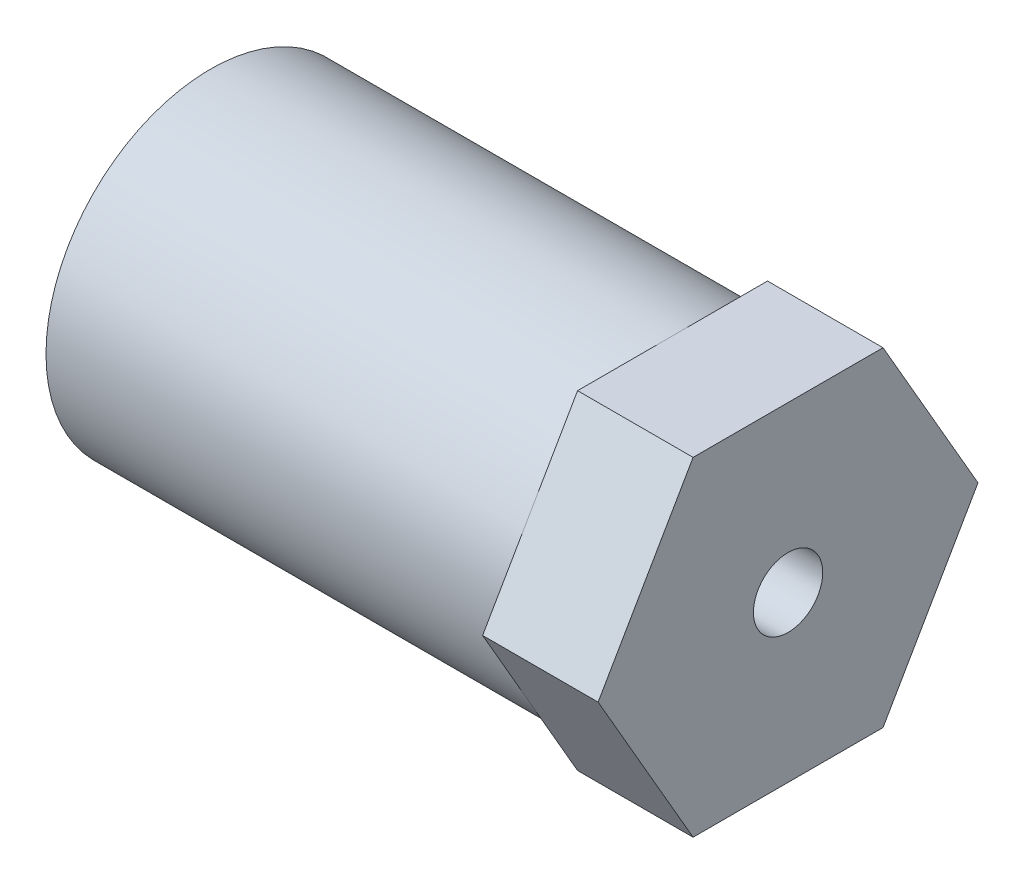
ISO-10303-21;
HEADER;
FILE_DESCRIPTION(('STEP AP214'),'2;1');
FILE_NAME('part.step','',(''),(''),'','','');
FILE_SCHEMA(('AUTOMOTIVE_DESIGN { 1 0 10303 214 1 1 1 1 }'));
ENDSEC;
DATA;
#1=APPLICATION_CONTEXT('core data for automotive mechanical design processes');
#2=APPLICATION_PROTOCOL_DEFINITION('international standard','automotive_design',2000,#1);
#3=PRODUCT_CONTEXT('',#1,'mechanical');
#4=PRODUCT('Part','Part','',(#3));
#5=PRODUCT_RELATED_PRODUCT_CATEGORY('part','',(#4));
#6=PRODUCT_DEFINITION_FORMATION('','',#4);
#7=PRODUCT_DEFINITION_CONTEXT('part definition',#1,'design');
#8=PRODUCT_DEFINITION('design','',#6,#7);
#9=PRODUCT_DEFINITION_SHAPE('','',#8);
#10=(LENGTH_UNIT() NAMED_UNIT(*) SI_UNIT(.MILLI.,.METRE.));
#11=(NAMED_UNIT(*) PLANE_ANGLE_UNIT() SI_UNIT($,.RADIAN.));
#12=(NAMED_UNIT(*) SI_UNIT($,.STERADIAN.) SOLID_ANGLE_UNIT());
#13=UNCERTAINTY_MEASURE_WITH_UNIT(LENGTH_MEASURE(1.E-05),#10,'distance_accuracy_value','');
#14=(GEOMETRIC_REPRESENTATION_CONTEXT(3) GLOBAL_UNCERTAINTY_ASSIGNED_CONTEXT((#13)) GLOBAL_UNIT_ASSIGNED_CONTEXT((#10,
#11,#12)) REPRESENTATION_CONTEXT('',''));
#15=CARTESIAN_POINT('',(0.,0.,0.));
#16=DIRECTION('',(0.,0.,1.));
#17=DIRECTION('',(1.,0.,0.));
#18=AXIS2_PLACEMENT_3D('',#15,#16,#17);
#19=CARTESIAN_POINT('',(0.,7.12,0.));
#20=DIRECTION('',(1.,0.,0.));
#21=DIRECTION('',(0.,0.,-1.));
#22=AXIS2_PLACEMENT_3D('',#19,#20,#21);
#23=PLANE('',#22);
#24=CARTESIAN_POINT('',(0.,0.,0.));
#25=DIRECTION('',(-1.,0.,0.));
#26=DIRECTION('',(0.,0.,1.));
#27=AXIS2_PLACEMENT_3D('',#24,#25,#26);
#28=CIRCLE('',#27,3.);
#29=CARTESIAN_POINT('',(0.,0.,3.));
#30=VERTEX_POINT('',#29);
#31=EDGE_CURVE('E145',#30,#30,#28,.T.);
#32=ORIENTED_EDGE('',*,*,#31,.F.);
#33=EDGE_LOOP('',(#32));
#34=FACE_BOUND('',#33,.T.);
#35=CARTESIAN_POINT('',(0.,0.,0.));
#36=DIRECTION('',(-1.,0.,0.));
#37=DIRECTION('',(0.,0.,1.));
#38=AXIS2_PLACEMENT_3D('',#35,#36,#37);
#39=CIRCLE('',#38,7.12);
#40=CARTESIAN_POINT('',(0.,0.,7.12));
#41=VERTEX_POINT('',#40);
#42=EDGE_CURVE('E156',#41,#41,#39,.T.);
#43=ORIENTED_EDGE('',*,*,#42,.T.);
#44=EDGE_LOOP('',(#43));
#45=FACE_BOUND('',#44,.T.);
#46=ADVANCED_FACE('F45',(#34,#45),#23,.F.);
#47=CARTESIAN_POINT('',(-15.9769543124888,0.,0.));
#48=DIRECTION('',(-1.,0.,0.));
#49=DIRECTION('',(0.,0.,1.));
#50=AXIS2_PLACEMENT_3D('',#47,#48,#49);
#51=CYLINDRICAL_SURFACE('',#50,7.12);
#52=ORIENTED_EDGE('',*,*,#42,.F.);
#53=EDGE_LOOP('',(#52));
#54=FACE_BOUND('',#53,.T.);
#55=CARTESIAN_POINT('',(20.,0.,0.));
#56=DIRECTION('',(-1.,0.,0.));
#57=DIRECTION('',(0.,0.,1.));
#58=AXIS2_PLACEMENT_3D('',#55,#56,#57);
#59=CIRCLE('',#58,7.12);
#60=CARTESIAN_POINT('',(20.,3.56,6.16610087494521));
#61=VERTEX_POINT('',#60);
#62=CARTESIAN_POINT('',(20.,7.12,0.));
#63=VERTEX_POINT('',#62);
#64=EDGE_CURVE('E11',#61,#63,#59,.T.);
#65=ORIENTED_EDGE('',*,*,#64,.T.);
#66=CARTESIAN_POINT('',(20.,3.56,-6.1661008749452));
#67=VERTEX_POINT('',#66);
#68=EDGE_CURVE('E53',#63,#67,#59,.T.);
#69=ORIENTED_EDGE('',*,*,#68,.T.);
#70=CARTESIAN_POINT('',(20.,-3.56,-6.1661008749452));
#71=VERTEX_POINT('',#70);
#72=EDGE_CURVE('E69',#67,#71,#59,.T.);
#73=ORIENTED_EDGE('',*,*,#72,.T.);
#74=CARTESIAN_POINT('',(20.,-7.12,0.));
#75=VERTEX_POINT('',#74);
#76=EDGE_CURVE('E164',#71,#75,#59,.T.);
#77=ORIENTED_EDGE('',*,*,#76,.T.);
#78=CARTESIAN_POINT('',(20.,-3.56,6.16610087494521));
#79=VERTEX_POINT('',#78);
#80=EDGE_CURVE('E161',#75,#79,#59,.T.);
#81=ORIENTED_EDGE('',*,*,#80,.T.);
#82=EDGE_CURVE('E54',#79,#61,#59,.T.);
#83=ORIENTED_EDGE('',*,*,#82,.T.);
#84=EDGE_LOOP('',(#65,#69,#73,#77,#81,#83));
#85=FACE_BOUND('',#84,.T.);
#86=ADVANCED_FACE('F167',(#54,#85),#51,.T.);
#87=CARTESIAN_POINT('',(12.,0.,0.));
#88=DIRECTION('',(1.,0.,0.));
#89=DIRECTION('',(0.,0.,-1.));
#90=AXIS2_PLACEMENT_3D('',#87,#88,#89);
#91=PLANE('',#90);
#92=CARTESIAN_POINT('',(12.,0.,0.));
#93=DIRECTION('',(1.,0.,0.));
#94=DIRECTION('',(0.,0.,-1.));
#95=AXIS2_PLACEMENT_3D('',#92,#93,#94);
#96=CIRCLE('',#95,1.5);
#97=CARTESIAN_POINT('',(12.,0.,-1.5));
#98=VERTEX_POINT('',#97);
#99=EDGE_CURVE('E214',#98,#98,#96,.T.);
#100=ORIENTED_EDGE('',*,*,#99,.T.);
#101=EDGE_LOOP('',(#100));
#102=FACE_BOUND('',#101,.T.);
#103=CARTESIAN_POINT('',(12.,0.,0.));
#104=DIRECTION('',(-1.,0.,0.));
#105=DIRECTION('',(0.,0.,1.));
#106=AXIS2_PLACEMENT_3D('',#103,#104,#105);
#107=CIRCLE('',#106,3.);
#108=CARTESIAN_POINT('',(12.,0.,3.));
#109=VERTEX_POINT('',#108);
#110=EDGE_CURVE('E148',#109,#109,#107,.T.);
#111=ORIENTED_EDGE('',*,*,#110,.T.);
#112=EDGE_LOOP('',(#111));
#113=FACE_BOUND('',#112,.T.);
#114=ADVANCED_FACE('F248',(#102,#113),#91,.F.);
#115=CARTESIAN_POINT('',(-15.9769543124888,0.,0.));
#116=DIRECTION('',(-1.,0.,0.));
#117=DIRECTION('',(0.,0.,1.));
#118=AXIS2_PLACEMENT_3D('',#115,#116,#117);
#119=CYLINDRICAL_SURFACE('',#118,3.);
#120=ORIENTED_EDGE('',*,*,#110,.F.);
#121=EDGE_LOOP('',(#120));
#122=FACE_BOUND('',#121,.T.);
#123=ORIENTED_EDGE('',*,*,#31,.T.);
#124=EDGE_LOOP('',(#123));
#125=FACE_BOUND('',#124,.T.);
#126=ADVANCED_FACE('F252',(#122,#125),#119,.F.);
#127=CARTESIAN_POINT('',(20.,0.,0.));
#128=DIRECTION('',(1.,0.,0.));
#129=DIRECTION('',(0.,0.,-1.));
#130=AXIS2_PLACEMENT_3D('',#127,#128,#129);
#131=PLANE('',#130);
#132=ORIENTED_EDGE('',*,*,#64,.F.);
#133=DIRECTION('',(0.,-0.866025403784439,0.5));
#134=VECTOR('',#133,1.);
#135=CARTESIAN_POINT('',(20.,7.12,4.11073391663014));
#136=LINE('',#135,#134);
#137=CARTESIAN_POINT('',(20.,7.12,4.11073391663014));
#138=VERTEX_POINT('',#137);
#139=EDGE_CURVE('E61',#138,#61,#136,.T.);
#140=ORIENTED_EDGE('',*,*,#139,.F.);
#141=DIRECTION('',(0.,0.,1.));
#142=VECTOR('',#141,1.);
#143=CARTESIAN_POINT('',(20.,7.12,-4.11073391663013));
#144=LINE('',#143,#142);
#145=EDGE_CURVE('E177',#63,#138,#144,.T.);
#146=ORIENTED_EDGE('',*,*,#145,.F.);
#147=EDGE_LOOP('',(#132,#140,#146));
#148=FACE_BOUND('',#147,.T.);
#149=ADVANCED_FACE('F178',(#148),#131,.F.);
#150=ORIENTED_EDGE('',*,*,#68,.F.);
#151=CARTESIAN_POINT('',(20.,7.12,-4.11073391663013));
#152=VERTEX_POINT('',#151);
#153=EDGE_CURVE('E174',#152,#63,#144,.T.);
#154=ORIENTED_EDGE('',*,*,#153,.F.);
#155=DIRECTION('',(0.,0.866025403784439,0.5));
#156=VECTOR('',#155,1.);
#157=CARTESIAN_POINT('',(20.,0.,-8.22146783326027));
#158=LINE('',#157,#156);
#159=EDGE_CURVE('E175',#67,#152,#158,.T.);
#160=ORIENTED_EDGE('',*,*,#159,.F.);
#161=EDGE_LOOP('',(#150,#154,#160));
#162=FACE_BOUND('',#161,.T.);
#163=ADVANCED_FACE('F172',(#162),#131,.F.);
#164=ORIENTED_EDGE('',*,*,#72,.F.);
#165=CARTESIAN_POINT('',(20.,0.,-8.22146783326027));
#166=VERTEX_POINT('',#165);
#167=EDGE_CURVE('E181',#166,#67,#158,.T.);
#168=ORIENTED_EDGE('',*,*,#167,.F.);
#169=DIRECTION('',(0.,0.866025403784439,-0.5));
#170=VECTOR('',#169,1.);
#171=CARTESIAN_POINT('',(20.,-7.12,-4.11073391663013));
#172=LINE('',#171,#170);
#173=EDGE_CURVE('E144',#71,#166,#172,.T.);
#174=ORIENTED_EDGE('',*,*,#173,.F.);
#175=EDGE_LOOP('',(#164,#168,#174));
#176=FACE_BOUND('',#175,.T.);
#177=ADVANCED_FACE('F282',(#176),#131,.F.);
#178=ORIENTED_EDGE('',*,*,#76,.F.);
#179=CARTESIAN_POINT('',(20.,-7.12,-4.11073391663013));
#180=VERTEX_POINT('',#179);
#181=EDGE_CURVE('E212',#180,#71,#172,.T.);
#182=ORIENTED_EDGE('',*,*,#181,.F.);
#183=DIRECTION('',(0.,0.,-1.));
#184=VECTOR('',#183,1.);
#185=CARTESIAN_POINT('',(20.,-7.12,4.11073391663014));
#186=LINE('',#185,#184);
#187=EDGE_CURVE('E193',#75,#180,#186,.T.);
#188=ORIENTED_EDGE('',*,*,#187,.F.);
#189=EDGE_LOOP('',(#178,#182,#188));
#190=FACE_BOUND('',#189,.T.);
#191=ADVANCED_FACE('F281',(#190),#131,.F.);
#192=ORIENTED_EDGE('',*,*,#80,.F.);
#193=CARTESIAN_POINT('',(20.,-7.12,4.11073391663014));
#194=VERTEX_POINT('',#193);
#195=EDGE_CURVE('E140',#194,#75,#186,.T.);
#196=ORIENTED_EDGE('',*,*,#195,.F.);
#197=DIRECTION('',(0.,-0.866025403784439,-0.5));
#198=VECTOR('',#197,1.);
#199=CARTESIAN_POINT('',(20.,0.,8.22146783326027));
#200=LINE('',#199,#198);
#201=EDGE_CURVE('E189',#79,#194,#200,.T.);
#202=ORIENTED_EDGE('',*,*,#201,.F.);
#203=EDGE_LOOP('',(#192,#196,#202));
#204=FACE_BOUND('',#203,.T.);
#205=ADVANCED_FACE('F236',(#204),#131,.F.);
#206=CARTESIAN_POINT('',(25.,-7.12,-4.11073391663013));
#207=DIRECTION('',(0.,0.5,0.866025403784439));
#208=DIRECTION('',(0.,-0.866025403784439,0.5));
#209=AXIS2_PLACEMENT_3D('',#206,#207,#208);
#210=PLANE('',#209);
#211=ORIENTED_EDGE('',*,*,#181,.T.);
#212=ORIENTED_EDGE('',*,*,#173,.T.);
#213=DIRECTION('',(-1.,0.,0.));
#214=VECTOR('',#213,1.);
#215=CARTESIAN_POINT('',(25.,0.,-8.22146783326027));
#216=LINE('',#215,#214);
#217=CARTESIAN_POINT('',(25.,0.,-8.22146783326027));
#218=VERTEX_POINT('',#217);
#219=EDGE_CURVE('E125',#218,#166,#216,.T.);
#220=ORIENTED_EDGE('',*,*,#219,.F.);
#221=DIRECTION('',(0.,0.866025403784439,-0.5));
#222=VECTOR('',#221,1.);
#223=CARTESIAN_POINT('',(25.,-7.12,-4.11073391663013));
#224=LINE('',#223,#222);
#225=CARTESIAN_POINT('',(25.,-7.12,-4.11073391663013));
#226=VERTEX_POINT('',#225);
#227=EDGE_CURVE('E131',#226,#218,#224,.T.);
#228=ORIENTED_EDGE('',*,*,#227,.F.);
#229=DIRECTION('',(-1.,0.,0.));
#230=VECTOR('',#229,1.);
#231=CARTESIAN_POINT('',(25.,-7.12,-4.11073391663013));
#232=LINE('',#231,#230);
#233=EDGE_CURVE('E196',#226,#180,#232,.T.);
#234=ORIENTED_EDGE('',*,*,#233,.T.);
#235=EDGE_LOOP('',(#211,#212,#220,#228,#234));
#236=FACE_BOUND('',#235,.T.);
#237=ADVANCED_FACE('F143',(#236),#210,.F.);
#238=CARTESIAN_POINT('',(25.,0.,-8.22146783326027));
#239=DIRECTION('',(0.,-0.5,0.866025403784439));
#240=DIRECTION('',(0.,-0.866025403784439,-0.5));
#241=AXIS2_PLACEMENT_3D('',#238,#239,#240);
#242=PLANE('',#241);
#243=ORIENTED_EDGE('',*,*,#167,.T.);
#244=ORIENTED_EDGE('',*,*,#159,.T.);
#245=DIRECTION('',(-1.,0.,0.));
#246=VECTOR('',#245,1.);
#247=CARTESIAN_POINT('',(25.,7.12,-4.11073391663013));
#248=LINE('',#247,#246);
#249=CARTESIAN_POINT('',(25.,7.12,-4.11073391663013));
#250=VERTEX_POINT('',#249);
#251=EDGE_CURVE('E127',#250,#152,#248,.T.);
#252=ORIENTED_EDGE('',*,*,#251,.F.);
#253=DIRECTION('',(0.,0.866025403784439,0.5));
#254=VECTOR('',#253,1.);
#255=CARTESIAN_POINT('',(25.,0.,-8.22146783326027));
#256=LINE('',#255,#254);
#257=EDGE_CURVE('E120',#218,#250,#256,.T.);
#258=ORIENTED_EDGE('',*,*,#257,.F.);
#259=ORIENTED_EDGE('',*,*,#219,.T.);
#260=EDGE_LOOP('',(#243,#244,#252,#258,#259));
#261=FACE_BOUND('',#260,.T.);
#262=ADVANCED_FACE('F123',(#261),#242,.F.);
#263=CARTESIAN_POINT('',(25.,7.12,-4.11073391663013));
#264=DIRECTION('',(0.,-1.,0.));
#265=DIRECTION('',(0.,0.,-1.));
#266=AXIS2_PLACEMENT_3D('',#263,#264,#265);
#267=PLANE('',#266);
#268=ORIENTED_EDGE('',*,*,#153,.T.);
#269=ORIENTED_EDGE('',*,*,#145,.T.);
#270=DIRECTION('',(-1.,0.,0.));
#271=VECTOR('',#270,1.);
#272=CARTESIAN_POINT('',(25.,7.12,4.11073391663014));
#273=LINE('',#272,#271);
#274=CARTESIAN_POINT('',(25.,7.12,4.11073391663014));
#275=VERTEX_POINT('',#274);
#276=EDGE_CURVE('E150',#275,#138,#273,.T.);
#277=ORIENTED_EDGE('',*,*,#276,.F.);
#278=DIRECTION('',(0.,0.,1.));
#279=VECTOR('',#278,1.);
#280=CARTESIAN_POINT('',(25.,7.12,-4.11073391663013));
#281=LINE('',#280,#279);
#282=EDGE_CURVE('E130',#250,#275,#281,.T.);
#283=ORIENTED_EDGE('',*,*,#282,.F.);
#284=ORIENTED_EDGE('',*,*,#251,.T.);
#285=EDGE_LOOP('',(#268,#269,#277,#283,#284));
#286=FACE_BOUND('',#285,.T.);
#287=ADVANCED_FACE('F183',(#286),#267,.F.);
#288=CARTESIAN_POINT('',(25.,7.12,4.11073391663014));
#289=DIRECTION('',(0.,-0.5,-0.866025403784439));
#290=DIRECTION('',(0.,0.866025403784439,-0.5));
#291=AXIS2_PLACEMENT_3D('',#288,#289,#290);
#292=PLANE('',#291);
#293=ORIENTED_EDGE('',*,*,#139,.T.);
#294=CARTESIAN_POINT('',(20.,0.,8.22146783326027));
#295=VERTEX_POINT('',#294);
#296=EDGE_CURVE('E184',#61,#295,#136,.T.);
#297=ORIENTED_EDGE('',*,*,#296,.T.);
#298=DIRECTION('',(-1.,0.,0.));
#299=VECTOR('',#298,1.);
#300=CARTESIAN_POINT('',(25.,0.,8.22146783326027));
#301=LINE('',#300,#299);
#302=CARTESIAN_POINT('',(25.,0.,8.22146783326027));
#303=VERTEX_POINT('',#302);
#304=EDGE_CURVE('E201',#303,#295,#301,.T.);
#305=ORIENTED_EDGE('',*,*,#304,.F.);
#306=DIRECTION('',(0.,-0.866025403784439,0.5));
#307=VECTOR('',#306,1.);
#308=CARTESIAN_POINT('',(25.,7.12,4.11073391663014));
#309=LINE('',#308,#307);
#310=EDGE_CURVE('E206',#275,#303,#309,.T.);
#311=ORIENTED_EDGE('',*,*,#310,.F.);
#312=ORIENTED_EDGE('',*,*,#276,.T.);
#313=EDGE_LOOP('',(#293,#297,#305,#311,#312));
#314=FACE_BOUND('',#313,.T.);
#315=ADVANCED_FACE('F204',(#314),#292,.F.);
#316=CARTESIAN_POINT('',(25.,0.,8.22146783326027));
#317=DIRECTION('',(0.,0.5,-0.866025403784439));
#318=DIRECTION('',(0.,0.866025403784439,0.5));
#319=AXIS2_PLACEMENT_3D('',#316,#317,#318);
#320=PLANE('',#319);
#321=EDGE_CURVE('E190',#295,#79,#200,.T.);
#322=ORIENTED_EDGE('',*,*,#321,.T.);
#323=ORIENTED_EDGE('',*,*,#201,.T.);
#324=DIRECTION('',(-1.,0.,0.));
#325=VECTOR('',#324,1.);
#326=CARTESIAN_POINT('',(25.,-7.12,4.11073391663014));
#327=LINE('',#326,#325);
#328=CARTESIAN_POINT('',(25.,-7.12,4.11073391663014));
#329=VERTEX_POINT('',#328);
#330=EDGE_CURVE('E198',#329,#194,#327,.T.);
#331=ORIENTED_EDGE('',*,*,#330,.F.);
#332=DIRECTION('',(0.,-0.866025403784439,-0.5));
#333=VECTOR('',#332,1.);
#334=CARTESIAN_POINT('',(25.,0.,8.22146783326027));
#335=LINE('',#334,#333);
#336=EDGE_CURVE('E208',#303,#329,#335,.T.);
#337=ORIENTED_EDGE('',*,*,#336,.F.);
#338=ORIENTED_EDGE('',*,*,#304,.T.);
#339=EDGE_LOOP('',(#322,#323,#331,#337,#338));
#340=FACE_BOUND('',#339,.T.);
#341=ADVANCED_FACE('F238',(#340),#320,.F.);
#342=CARTESIAN_POINT('',(25.,-7.12,4.11073391663014));
#343=DIRECTION('',(0.,1.,0.));
#344=DIRECTION('',(0.,0.,1.));
#345=AXIS2_PLACEMENT_3D('',#342,#343,#344);
#346=PLANE('',#345);
#347=ORIENTED_EDGE('',*,*,#195,.T.);
#348=ORIENTED_EDGE('',*,*,#187,.T.);
#349=ORIENTED_EDGE('',*,*,#233,.F.);
#350=DIRECTION('',(0.,0.,-1.));
#351=VECTOR('',#350,1.);
#352=CARTESIAN_POINT('',(25.,-7.12,4.11073391663014));
#353=LINE('',#352,#351);
#354=EDGE_CURVE('E136',#329,#226,#353,.T.);
#355=ORIENTED_EDGE('',*,*,#354,.F.);
#356=ORIENTED_EDGE('',*,*,#330,.T.);
#357=EDGE_LOOP('',(#347,#348,#349,#355,#356));
#358=FACE_BOUND('',#357,.T.);
#359=ADVANCED_FACE('F227',(#358),#346,.F.);
#360=CARTESIAN_POINT('',(25.,0.,0.));
#361=DIRECTION('',(1.,0.,0.));
#362=DIRECTION('',(0.,0.,-1.));
#363=AXIS2_PLACEMENT_3D('',#360,#361,#362);
#364=PLANE('',#363);
#365=CARTESIAN_POINT('',(25.,0.,0.));
#366=DIRECTION('',(1.,0.,0.));
#367=DIRECTION('',(0.,0.,-1.));
#368=AXIS2_PLACEMENT_3D('',#365,#366,#367);
#369=CIRCLE('',#368,1.5);
#370=CARTESIAN_POINT('',(25.,0.,-1.5));
#371=VERTEX_POINT('',#370);
#372=EDGE_CURVE('E48',#371,#371,#369,.T.);
#373=ORIENTED_EDGE('',*,*,#372,.F.);
#374=EDGE_LOOP('',(#373));
#375=FACE_BOUND('',#374,.T.);
#376=ORIENTED_EDGE('',*,*,#227,.T.);
#377=ORIENTED_EDGE('',*,*,#257,.T.);
#378=ORIENTED_EDGE('',*,*,#282,.T.);
#379=ORIENTED_EDGE('',*,*,#310,.T.);
#380=ORIENTED_EDGE('',*,*,#336,.T.);
#381=ORIENTED_EDGE('',*,*,#354,.T.);
#382=EDGE_LOOP('',(#376,#377,#378,#379,#380,#381));
#383=FACE_BOUND('',#382,.T.);
#384=ADVANCED_FACE('F134',(#375,#383),#364,.T.);
#385=ORIENTED_EDGE('',*,*,#82,.F.);
#386=ORIENTED_EDGE('',*,*,#321,.F.);
#387=ORIENTED_EDGE('',*,*,#296,.F.);
#388=EDGE_LOOP('',(#385,#386,#387));
#389=FACE_BOUND('',#388,.T.);
#390=ADVANCED_FACE('F226',(#389),#131,.F.);
#391=CARTESIAN_POINT('',(0.,0.,0.));
#392=DIRECTION('',(1.,0.,0.));
#393=DIRECTION('',(0.,0.,-1.));
#394=AXIS2_PLACEMENT_3D('',#391,#392,#393);
#395=CYLINDRICAL_SURFACE('',#394,1.5);
#396=ORIENTED_EDGE('',*,*,#372,.T.);
#397=EDGE_LOOP('',(#396));
#398=FACE_BOUND('',#397,.T.);
#399=ORIENTED_EDGE('',*,*,#99,.F.);
#400=EDGE_LOOP('',(#399));
#401=FACE_BOUND('',#400,.T.);
#402=ADVANCED_FACE('F222',(#398,#401),#395,.F.);
#403=CLOSED_SHELL('',(#46,#86,#114,#126,#149,#163,#177,#191,#205,#237,#262,#287,#315,#341,#359,
#384,#390,#402));
#404=MANIFOLD_SOLID_BREP('B2',#403);
#405=ADVANCED_BREP_SHAPE_REPRESENTATION('',(#18,#404),#14);
#406=SHAPE_DEFINITION_REPRESENTATION(#9,#405);
ENDSEC;
END-ISO-10303-21;
